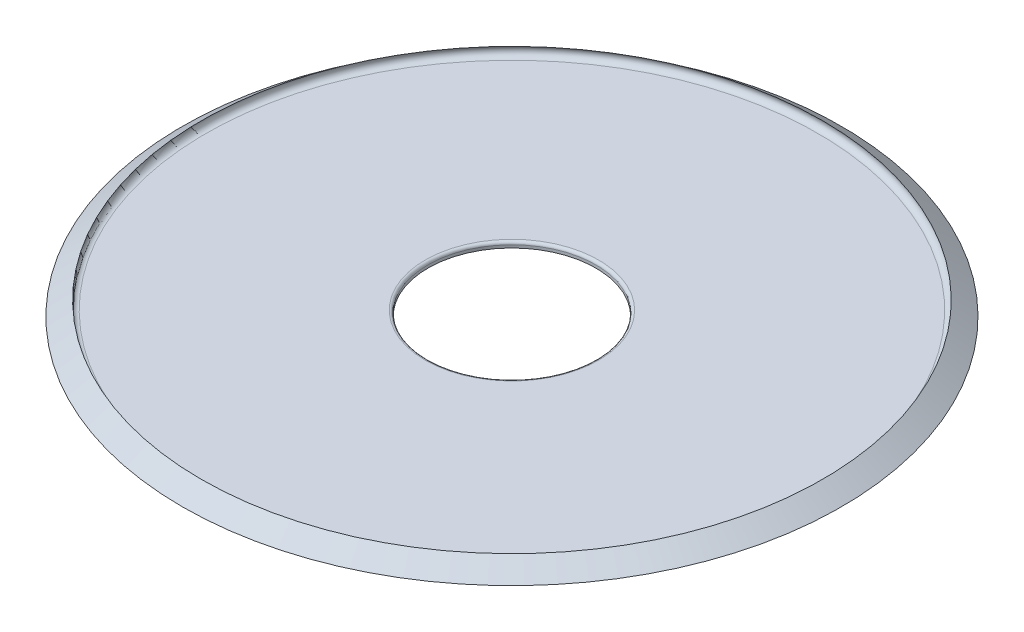
ISO-10303-21;
HEADER;
FILE_DESCRIPTION(('STEP AP214'),'2;1');
FILE_NAME('part.step','',(''),(''),'','','');
FILE_SCHEMA(('AUTOMOTIVE_DESIGN { 1 0 10303 214 1 1 1 1 }'));
ENDSEC;
DATA;
#1=APPLICATION_CONTEXT('core data for automotive mechanical design processes');
#2=APPLICATION_PROTOCOL_DEFINITION('international standard','automotive_design',2000,#1);
#3=PRODUCT_CONTEXT('',#1,'mechanical');
#4=PRODUCT('Part','Part','',(#3));
#5=PRODUCT_RELATED_PRODUCT_CATEGORY('part','',(#4));
#6=PRODUCT_DEFINITION_FORMATION('','',#4);
#7=PRODUCT_DEFINITION_CONTEXT('part definition',#1,'design');
#8=PRODUCT_DEFINITION('design','',#6,#7);
#9=PRODUCT_DEFINITION_SHAPE('','',#8);
#10=(LENGTH_UNIT() NAMED_UNIT(*) SI_UNIT(.MILLI.,.METRE.));
#11=(NAMED_UNIT(*) PLANE_ANGLE_UNIT() SI_UNIT($,.RADIAN.));
#12=(NAMED_UNIT(*) SI_UNIT($,.STERADIAN.) SOLID_ANGLE_UNIT());
#13=UNCERTAINTY_MEASURE_WITH_UNIT(LENGTH_MEASURE(1.E-05),#10,'distance_accuracy_value','');
#14=(GEOMETRIC_REPRESENTATION_CONTEXT(3) GLOBAL_UNCERTAINTY_ASSIGNED_CONTEXT((#13)) GLOBAL_UNIT_ASSIGNED_CONTEXT((#10,
#11,#12)) REPRESENTATION_CONTEXT('',''));
#15=CARTESIAN_POINT('',(0.,0.,0.));
#16=DIRECTION('',(0.,0.,1.));
#17=DIRECTION('',(1.,0.,0.));
#18=AXIS2_PLACEMENT_3D('',#15,#16,#17);
#19=CARTESIAN_POINT('',(0.,4.28,0.));
#20=DIRECTION('',(0.,1.,0.));
#21=DIRECTION('',(0.,0.,1.));
#22=AXIS2_PLACEMENT_3D('',#19,#20,#21);
#23=TOROIDAL_SURFACE('',#22,5.46534536877589,0.1);
#24=CARTESIAN_POINT('',(0.,4.33606060606061,0.));
#25=DIRECTION('',(0.,1.,0.));
#26=DIRECTION('',(0.,0.,1.));
#27=AXIS2_PLACEMENT_3D('',#24,#25,#26);
#28=CIRCLE('',#27,5.54815363193916);
#29=CARTESIAN_POINT('',(0.,4.33606060606061,5.54815363193916));
#30=VERTEX_POINT('',#29);
#31=EDGE_CURVE('E57',#30,#30,#28,.T.);
#32=ORIENTED_EDGE('',*,*,#31,.T.);
#33=EDGE_LOOP('',(#32));
#34=FACE_BOUND('',#33,.T.);
#35=CARTESIAN_POINT('',(0.,4.18,0.));
#36=DIRECTION('',(0.,1.,0.));
#37=DIRECTION('',(0.,0.,1.));
#38=AXIS2_PLACEMENT_3D('',#35,#36,#37);
#39=CIRCLE('',#38,5.46534536877589);
#40=CARTESIAN_POINT('',(0.,4.18,5.46534536877589));
#41=VERTEX_POINT('',#40);
#42=EDGE_CURVE('E10',#41,#41,#39,.T.);
#43=ORIENTED_EDGE('',*,*,#42,.F.);
#44=EDGE_LOOP('',(#43));
#45=FACE_BOUND('',#44,.T.);
#46=ADVANCED_FACE('F35',(#34,#45),#23,.F.);
#47=CARTESIAN_POINT('',(3.69306170083584,4.18,0.));
#48=DIRECTION('',(0.,1.,0.));
#49=DIRECTION('',(0.,0.,1.));
#50=AXIS2_PLACEMENT_3D('',#47,#48,#49);
#51=PLANE('',#50);
#52=ORIENTED_EDGE('',*,*,#42,.T.);
#53=EDGE_LOOP('',(#52));
#54=FACE_BOUND('',#53,.T.);
#55=CARTESIAN_POINT('',(0.,4.18,0.));
#56=DIRECTION('',(0.,1.,0.));
#57=DIRECTION('',(0.,0.,1.));
#58=AXIS2_PLACEMENT_3D('',#55,#56,#57);
#59=CIRCLE('',#58,1.55);
#60=CARTESIAN_POINT('',(0.,4.18,1.55));
#61=VERTEX_POINT('',#60);
#62=EDGE_CURVE('E41',#61,#61,#59,.T.);
#63=ORIENTED_EDGE('',*,*,#62,.F.);
#64=EDGE_LOOP('',(#63));
#65=FACE_BOUND('',#64,.T.);
#66=ADVANCED_FACE('F75',(#54,#65),#51,.T.);
#67=CARTESIAN_POINT('',(0.,4.13,0.));
#68=DIRECTION('',(0.,1.,0.));
#69=DIRECTION('',(0.,0.,1.));
#70=AXIS2_PLACEMENT_3D('',#67,#68,#69);
#71=TOROIDAL_SURFACE('',#70,1.55,0.0499999999999998);
#72=ORIENTED_EDGE('',*,*,#62,.T.);
#73=EDGE_LOOP('',(#72));
#74=FACE_BOUND('',#73,.T.);
#75=CARTESIAN_POINT('',(0.,4.13000000000001,0.));
#76=DIRECTION('',(0.,1.,0.));
#77=DIRECTION('',(0.,0.,1.));
#78=AXIS2_PLACEMENT_3D('',#75,#76,#77);
#79=CIRCLE('',#78,1.5);
#80=CARTESIAN_POINT('',(0.,4.13000000000001,1.5));
#81=VERTEX_POINT('',#80);
#82=EDGE_CURVE('E45',#81,#81,#79,.T.);
#83=ORIENTED_EDGE('',*,*,#82,.F.);
#84=EDGE_LOOP('',(#83));
#85=FACE_BOUND('',#84,.T.);
#86=ADVANCED_FACE('F79',(#74,#85),#71,.T.);
#87=CARTESIAN_POINT('',(0.,6.13323498365352,0.));
#88=DIRECTION('',(0.,1.,0.));
#89=DIRECTION('',(0.,0.,1.));
#90=AXIS2_PLACEMENT_3D('',#87,#88,#89);
#91=CYLINDRICAL_SURFACE('',#90,1.5);
#92=CARTESIAN_POINT('',(0.,4.08,0.));
#93=DIRECTION('',(0.,1.,0.));
#94=DIRECTION('',(0.,0.,1.));
#95=AXIS2_PLACEMENT_3D('',#92,#93,#94);
#96=CIRCLE('',#95,1.5);
#97=CARTESIAN_POINT('',(0.,4.08,1.5));
#98=VERTEX_POINT('',#97);
#99=EDGE_CURVE('E49',#98,#98,#96,.T.);
#100=ORIENTED_EDGE('',*,*,#99,.F.);
#101=EDGE_LOOP('',(#100));
#102=FACE_BOUND('',#101,.T.);
#103=ORIENTED_EDGE('',*,*,#82,.T.);
#104=EDGE_LOOP('',(#103));
#105=FACE_BOUND('',#104,.T.);
#106=ADVANCED_FACE('F71',(#102,#105),#91,.F.);
#107=CARTESIAN_POINT('',(3.69306170083583,4.08,0.));
#108=DIRECTION('',(0.,1.,0.));
#109=DIRECTION('',(0.,0.,1.));
#110=AXIS2_PLACEMENT_3D('',#107,#108,#109);
#111=PLANE('',#110);
#112=CARTESIAN_POINT('',(0.,4.08,0.));
#113=DIRECTION('',(0.,1.,0.));
#114=DIRECTION('',(0.,0.,1.));
#115=AXIS2_PLACEMENT_3D('',#112,#113,#114);
#116=CIRCLE('',#115,5.88612340167167);
#117=CARTESIAN_POINT('',(0.,4.08,5.88612340167167));
#118=VERTEX_POINT('',#117);
#119=EDGE_CURVE('E54',#118,#118,#116,.T.);
#120=ORIENTED_EDGE('',*,*,#119,.F.);
#121=EDGE_LOOP('',(#120));
#122=FACE_BOUND('',#121,.T.);
#123=ORIENTED_EDGE('',*,*,#99,.T.);
#124=EDGE_LOOP('',(#123));
#125=FACE_BOUND('',#124,.T.);
#126=ADVANCED_FACE('F65',(#122,#125),#111,.F.);
#127=CARTESIAN_POINT('',(0.,4.33606060606061,0.));
#128=DIRECTION('',(0.,-1.,0.));
#129=DIRECTION('',(0.,0.,-1.));
#130=AXIS2_PLACEMENT_3D('',#127,#128,#129);
#131=CONICAL_SURFACE('',#130,5.54815363193916,0.922421285730585);
#132=ORIENTED_EDGE('',*,*,#119,.T.);
#133=EDGE_LOOP('',(#132));
#134=FACE_BOUND('',#133,.T.);
#135=ORIENTED_EDGE('',*,*,#31,.F.);
#136=EDGE_LOOP('',(#135));
#137=FACE_BOUND('',#136,.T.);
#138=ADVANCED_FACE('F63',(#134,#137),#131,.T.);
#139=CLOSED_SHELL('',(#46,#66,#86,#106,#126,#138));
#140=MANIFOLD_SOLID_BREP('B2',#139);
#141=ADVANCED_BREP_SHAPE_REPRESENTATION('',(#18,#140),#14);
#142=SHAPE_DEFINITION_REPRESENTATION(#9,#141);
ENDSEC;
END-ISO-10303-21;
